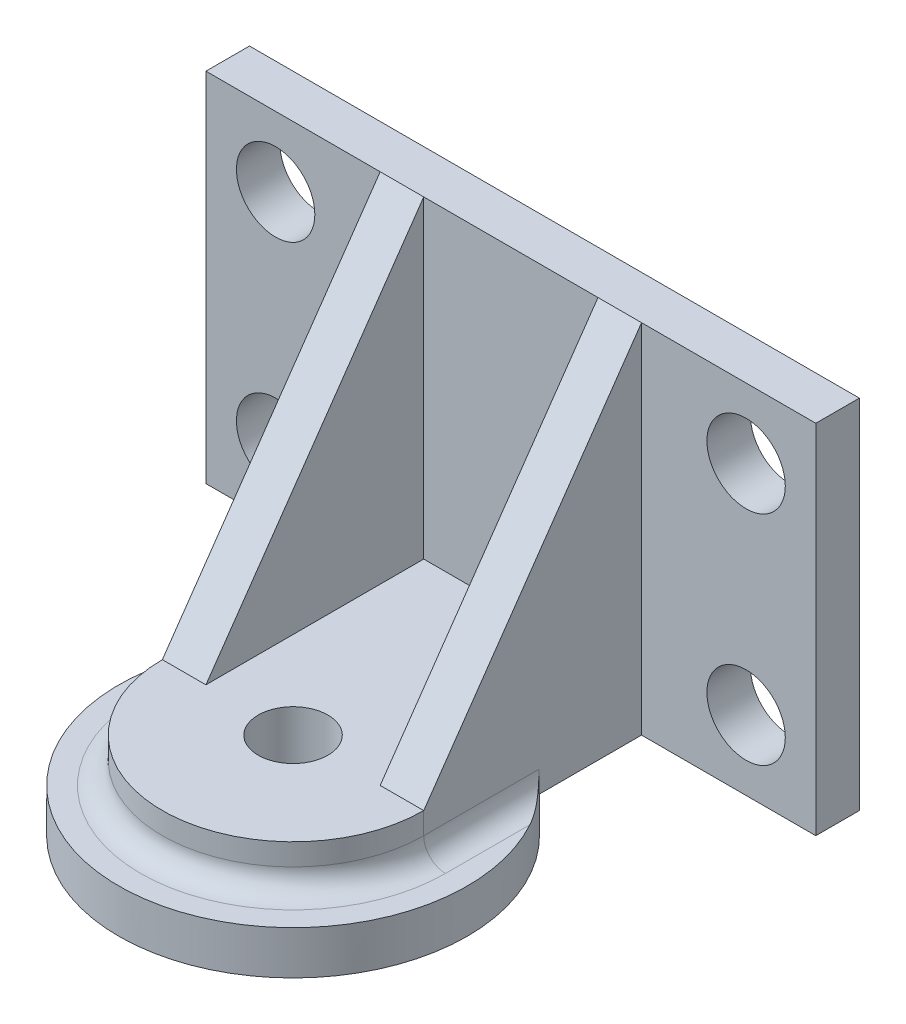
ISO-10303-21;
HEADER;
FILE_DESCRIPTION(('STEP AP214'),'2;1');
FILE_NAME('part.step','',(''),(''),'','','');
FILE_SCHEMA(('AUTOMOTIVE_DESIGN { 1 0 10303 214 1 1 1 1 }'));
ENDSEC;
DATA;
#1=APPLICATION_CONTEXT('core data for automotive mechanical design processes');
#2=APPLICATION_PROTOCOL_DEFINITION('international standard','automotive_design',2000,#1);
#3=PRODUCT_CONTEXT('',#1,'mechanical');
#4=PRODUCT('Part','Part','',(#3));
#5=PRODUCT_RELATED_PRODUCT_CATEGORY('part','',(#4));
#6=PRODUCT_DEFINITION_FORMATION('','',#4);
#7=PRODUCT_DEFINITION_CONTEXT('part definition',#1,'design');
#8=PRODUCT_DEFINITION('design','',#6,#7);
#9=PRODUCT_DEFINITION_SHAPE('','',#8);
#10=(LENGTH_UNIT() NAMED_UNIT(*) SI_UNIT(.MILLI.,.METRE.));
#11=(NAMED_UNIT(*) PLANE_ANGLE_UNIT() SI_UNIT($,.RADIAN.));
#12=(NAMED_UNIT(*) SI_UNIT($,.STERADIAN.) SOLID_ANGLE_UNIT());
#13=UNCERTAINTY_MEASURE_WITH_UNIT(LENGTH_MEASURE(1.E-05),#10,'distance_accuracy_value','');
#14=(GEOMETRIC_REPRESENTATION_CONTEXT(3) GLOBAL_UNCERTAINTY_ASSIGNED_CONTEXT((#13)) GLOBAL_UNIT_ASSIGNED_CONTEXT((#10,
#11,#12)) REPRESENTATION_CONTEXT('',''));
#15=CARTESIAN_POINT('',(0.,0.,0.));
#16=DIRECTION('',(0.,0.,1.));
#17=DIRECTION('',(1.,0.,0.));
#18=AXIS2_PLACEMENT_3D('',#15,#16,#17);
#19=CARTESIAN_POINT('',(0.,0.,5.));
#20=DIRECTION('',(0.,0.,1.));
#21=DIRECTION('',(1.,0.,0.));
#22=AXIS2_PLACEMENT_3D('',#19,#20,#21);
#23=PLANE('',#22);
#24=DIRECTION('',(0.,1.,0.));
#25=VECTOR('',#24,1.);
#26=CARTESIAN_POINT('',(-10.,20.5,5.));
#27=LINE('',#26,#25);
#28=CARTESIAN_POINT('',(-10.,-15.5,5.));
#29=VERTEX_POINT('',#28);
#30=CARTESIAN_POINT('',(-10.,20.5,5.));
#31=VERTEX_POINT('',#30);
#32=EDGE_CURVE('E238',#29,#31,#27,.T.);
#33=ORIENTED_EDGE('',*,*,#32,.F.);
#34=DIRECTION('',(1.,0.,0.));
#35=VECTOR('',#34,1.);
#36=CARTESIAN_POINT('',(-15.,-15.5,5.));
#37=LINE('',#36,#35);
#38=CARTESIAN_POINT('',(10.,-15.5,5.));
#39=VERTEX_POINT('',#38);
#40=EDGE_CURVE('E208',#29,#39,#37,.T.);
#41=ORIENTED_EDGE('',*,*,#40,.T.);
#42=DIRECTION('',(0.,-1.,0.));
#43=VECTOR('',#42,1.);
#44=CARTESIAN_POINT('',(10.,20.5,5.));
#45=LINE('',#44,#43);
#46=CARTESIAN_POINT('',(9.99999999999999,20.5,5.));
#47=VERTEX_POINT('',#46);
#48=EDGE_CURVE('E226',#47,#39,#45,.T.);
#49=ORIENTED_EDGE('',*,*,#48,.F.);
#50=DIRECTION('',(-1.,0.,0.));
#51=VECTOR('',#50,1.);
#52=CARTESIAN_POINT('',(-35.,20.5,5.));
#53=LINE('',#52,#51);
#54=EDGE_CURVE('E296',#47,#31,#53,.T.);
#55=ORIENTED_EDGE('',*,*,#54,.T.);
#56=EDGE_LOOP('',(#33,#41,#49,#55));
#57=FACE_BOUND('',#56,.T.);
#58=ADVANCED_FACE('F39',(#57),#23,.T.);
#59=CARTESIAN_POINT('',(-10.,20.5,30.));
#60=DIRECTION('',(-1.,0.,0.));
#61=DIRECTION('',(0.,-1.,0.));
#62=AXIS2_PLACEMENT_3D('',#59,#60,#61);
#63=PLANE('',#62);
#64=ORIENTED_EDGE('',*,*,#32,.T.);
#65=DIRECTION('',(0.,-0.821369965673296,0.570395809495344));
#66=VECTOR('',#65,1.);
#67=CARTESIAN_POINT('',(-10.,8.78735033836543,13.1337844872462));
#68=LINE('',#67,#66);
#69=CARTESIAN_POINT('',(-9.99999999999999,-15.5,30.));
#70=VERTEX_POINT('',#69);
#71=EDGE_CURVE('E200',#31,#70,#68,.T.);
#72=ORIENTED_EDGE('',*,*,#71,.T.);
#73=DIRECTION('',(0.,0.,1.));
#74=VECTOR('',#73,1.);
#75=CARTESIAN_POINT('',(-10.,-15.5,30.));
#76=LINE('',#75,#74);
#77=EDGE_CURVE('E222',#29,#70,#76,.T.);
#78=ORIENTED_EDGE('',*,*,#77,.F.);
#79=EDGE_LOOP('',(#64,#72,#78));
#80=FACE_BOUND('',#79,.T.);
#81=ADVANCED_FACE('F376',(#80),#63,.F.);
#82=CARTESIAN_POINT('',(10.,20.5,30.));
#83=DIRECTION('',(1.,0.,0.));
#84=DIRECTION('',(0.,0.,-1.));
#85=AXIS2_PLACEMENT_3D('',#82,#83,#84);
#86=PLANE('',#85);
#87=DIRECTION('',(0.,0.,-1.));
#88=VECTOR('',#87,1.);
#89=CARTESIAN_POINT('',(10.,-15.5,30.));
#90=LINE('',#89,#88);
#91=CARTESIAN_POINT('',(10.,-15.5,30.));
#92=VERTEX_POINT('',#91);
#93=EDGE_CURVE('E215',#92,#39,#90,.T.);
#94=ORIENTED_EDGE('',*,*,#93,.F.);
#95=DIRECTION('',(0.,0.821369965673296,-0.570395809495344));
#96=VECTOR('',#95,1.);
#97=CARTESIAN_POINT('',(10.,8.78735033836543,13.1337844872462));
#98=LINE('',#97,#96);
#99=EDGE_CURVE('E196',#92,#47,#98,.T.);
#100=ORIENTED_EDGE('',*,*,#99,.T.);
#101=ORIENTED_EDGE('',*,*,#48,.T.);
#102=EDGE_LOOP('',(#94,#100,#101));
#103=FACE_BOUND('',#102,.T.);
#104=ADVANCED_FACE('F384',(#103),#86,.F.);
#105=CARTESIAN_POINT('',(27.,12.5,5.));
#106=DIRECTION('',(0.,0.,1.));
#107=DIRECTION('',(1.,0.,0.));
#108=AXIS2_PLACEMENT_3D('',#105,#106,#107);
#109=CIRCLE('',#108,4.5);
#110=CARTESIAN_POINT('',(31.5,12.5,5.));
#111=VERTEX_POINT('',#110);
#112=EDGE_CURVE('E254',#111,#111,#109,.T.);
#113=ORIENTED_EDGE('',*,*,#112,.F.);
#114=EDGE_LOOP('',(#113));
#115=FACE_BOUND('',#114,.T.);
#116=CARTESIAN_POINT('',(27.,-12.5,5.));
#117=DIRECTION('',(0.,0.,1.));
#118=DIRECTION('',(1.,0.,0.));
#119=AXIS2_PLACEMENT_3D('',#116,#117,#118);
#120=CIRCLE('',#119,4.5);
#121=CARTESIAN_POINT('',(31.5,-12.5,5.));
#122=VERTEX_POINT('',#121);
#123=EDGE_CURVE('E246',#122,#122,#120,.T.);
#124=ORIENTED_EDGE('',*,*,#123,.F.);
#125=EDGE_LOOP('',(#124));
#126=FACE_BOUND('',#125,.T.);
#127=CARTESIAN_POINT('',(35.,20.5,5.));
#128=VERTEX_POINT('',#127);
#129=CARTESIAN_POINT('',(15.,20.5,5.));
#130=VERTEX_POINT('',#129);
#131=EDGE_CURVE('E291',#128,#130,#53,.T.);
#132=ORIENTED_EDGE('',*,*,#131,.T.);
#133=DIRECTION('',(0.,1.,0.));
#134=VECTOR('',#133,1.);
#135=CARTESIAN_POINT('',(15.,20.5,5.));
#136=LINE('',#135,#134);
#137=CARTESIAN_POINT('',(15.,-20.5,5.));
#138=VERTEX_POINT('',#137);
#139=EDGE_CURVE('E229',#138,#130,#136,.T.);
#140=ORIENTED_EDGE('',*,*,#139,.F.);
#141=DIRECTION('',(1.,0.,0.));
#142=VECTOR('',#141,1.);
#143=CARTESIAN_POINT('',(-35.,-20.5,5.));
#144=LINE('',#143,#142);
#145=CARTESIAN_POINT('',(35.,-20.5,5.));
#146=VERTEX_POINT('',#145);
#147=EDGE_CURVE('E166',#138,#146,#144,.T.);
#148=ORIENTED_EDGE('',*,*,#147,.T.);
#149=DIRECTION('',(0.,1.,0.));
#150=VECTOR('',#149,1.);
#151=CARTESIAN_POINT('',(35.,20.5,5.));
#152=LINE('',#151,#150);
#153=EDGE_CURVE('E287',#146,#128,#152,.T.);
#154=ORIENTED_EDGE('',*,*,#153,.T.);
#155=EDGE_LOOP('',(#132,#140,#148,#154));
#156=FACE_BOUND('',#155,.T.);
#157=ADVANCED_FACE('F379',(#115,#126,#156),#23,.T.);
#158=DIRECTION('',(0.,-1.,0.));
#159=VECTOR('',#158,1.);
#160=CARTESIAN_POINT('',(-15.,20.5,5.));
#161=LINE('',#160,#159);
#162=CARTESIAN_POINT('',(-15.,20.5,5.));
#163=VERTEX_POINT('',#162);
#164=CARTESIAN_POINT('',(-15.,-20.5,5.));
#165=VERTEX_POINT('',#164);
#166=EDGE_CURVE('E168',#163,#165,#161,.T.);
#167=ORIENTED_EDGE('',*,*,#166,.F.);
#168=CARTESIAN_POINT('',(-35.,20.5,5.));
#169=VERTEX_POINT('',#168);
#170=EDGE_CURVE('E290',#163,#169,#53,.T.);
#171=ORIENTED_EDGE('',*,*,#170,.T.);
#172=DIRECTION('',(0.,-1.,0.));
#173=VECTOR('',#172,1.);
#174=CARTESIAN_POINT('',(-35.,20.5,5.));
#175=LINE('',#174,#173);
#176=CARTESIAN_POINT('',(-35.,-20.5,5.));
#177=VERTEX_POINT('',#176);
#178=EDGE_CURVE('E278',#169,#177,#175,.T.);
#179=ORIENTED_EDGE('',*,*,#178,.T.);
#180=EDGE_CURVE('E283',#177,#165,#144,.T.);
#181=ORIENTED_EDGE('',*,*,#180,.T.);
#182=EDGE_LOOP('',(#167,#171,#179,#181));
#183=FACE_BOUND('',#182,.T.);
#184=CARTESIAN_POINT('',(-27.,-12.5,5.));
#185=DIRECTION('',(0.,0.,1.));
#186=DIRECTION('',(1.,0.,0.));
#187=AXIS2_PLACEMENT_3D('',#184,#185,#186);
#188=CIRCLE('',#187,4.5);
#189=CARTESIAN_POINT('',(-22.5,-12.5,5.));
#190=VERTEX_POINT('',#189);
#191=EDGE_CURVE('E262',#190,#190,#188,.T.);
#192=ORIENTED_EDGE('',*,*,#191,.F.);
#193=EDGE_LOOP('',(#192));
#194=FACE_BOUND('',#193,.T.);
#195=CARTESIAN_POINT('',(-27.,12.5,5.));
#196=DIRECTION('',(0.,0.,1.));
#197=DIRECTION('',(1.,0.,0.));
#198=AXIS2_PLACEMENT_3D('',#195,#196,#197);
#199=CIRCLE('',#198,4.5);
#200=CARTESIAN_POINT('',(-22.5,12.5,5.));
#201=VERTEX_POINT('',#200);
#202=EDGE_CURVE('E270',#201,#201,#199,.T.);
#203=ORIENTED_EDGE('',*,*,#202,.F.);
#204=EDGE_LOOP('',(#203));
#205=FACE_BOUND('',#204,.T.);
#206=ADVANCED_FACE('F380',(#183,#194,#205),#23,.T.);
#207=CARTESIAN_POINT('',(0.,0.,0.));
#208=DIRECTION('',(0.,0.,1.));
#209=DIRECTION('',(1.,0.,0.));
#210=AXIS2_PLACEMENT_3D('',#207,#208,#209);
#211=PLANE('',#210);
#212=DIRECTION('',(0.,-1.,0.));
#213=VECTOR('',#212,1.);
#214=CARTESIAN_POINT('',(-35.,20.5,0.));
#215=LINE('',#214,#213);
#216=CARTESIAN_POINT('',(-35.,20.5,0.));
#217=VERTEX_POINT('',#216);
#218=CARTESIAN_POINT('',(-35.,-20.5,0.));
#219=VERTEX_POINT('',#218);
#220=EDGE_CURVE('E274',#217,#219,#215,.T.);
#221=ORIENTED_EDGE('',*,*,#220,.F.);
#222=DIRECTION('',(-1.,0.,0.));
#223=VECTOR('',#222,1.);
#224=CARTESIAN_POINT('',(-35.,20.5,0.));
#225=LINE('',#224,#223);
#226=CARTESIAN_POINT('',(35.,20.5,0.));
#227=VERTEX_POINT('',#226);
#228=EDGE_CURVE('E282',#227,#217,#225,.T.);
#229=ORIENTED_EDGE('',*,*,#228,.F.);
#230=DIRECTION('',(0.,1.,0.));
#231=VECTOR('',#230,1.);
#232=CARTESIAN_POINT('',(35.,20.5,0.));
#233=LINE('',#232,#231);
#234=CARTESIAN_POINT('',(35.,-20.5,0.));
#235=VERTEX_POINT('',#234);
#236=EDGE_CURVE('E303',#235,#227,#233,.T.);
#237=ORIENTED_EDGE('',*,*,#236,.F.);
#238=DIRECTION('',(1.,0.,0.));
#239=VECTOR('',#238,1.);
#240=CARTESIAN_POINT('',(-35.,-20.5,0.));
#241=LINE('',#240,#239);
#242=EDGE_CURVE('E300',#219,#235,#241,.T.);
#243=ORIENTED_EDGE('',*,*,#242,.F.);
#244=EDGE_LOOP('',(#221,#229,#237,#243));
#245=FACE_BOUND('',#244,.T.);
#246=CARTESIAN_POINT('',(-27.,12.5,0.));
#247=DIRECTION('',(0.,0.,1.));
#248=DIRECTION('',(1.,0.,0.));
#249=AXIS2_PLACEMENT_3D('',#246,#247,#248);
#250=CIRCLE('',#249,4.5);
#251=CARTESIAN_POINT('',(-22.5,12.5,0.));
#252=VERTEX_POINT('',#251);
#253=EDGE_CURVE('E266',#252,#252,#250,.T.);
#254=ORIENTED_EDGE('',*,*,#253,.T.);
#255=EDGE_LOOP('',(#254));
#256=FACE_BOUND('',#255,.T.);
#257=CARTESIAN_POINT('',(-27.,-12.5,0.));
#258=DIRECTION('',(0.,0.,1.));
#259=DIRECTION('',(1.,0.,0.));
#260=AXIS2_PLACEMENT_3D('',#257,#258,#259);
#261=CIRCLE('',#260,4.5);
#262=CARTESIAN_POINT('',(-22.5,-12.5,0.));
#263=VERTEX_POINT('',#262);
#264=EDGE_CURVE('E258',#263,#263,#261,.T.);
#265=ORIENTED_EDGE('',*,*,#264,.T.);
#266=EDGE_LOOP('',(#265));
#267=FACE_BOUND('',#266,.T.);
#268=CARTESIAN_POINT('',(27.,12.5,0.));
#269=DIRECTION('',(0.,0.,1.));
#270=DIRECTION('',(1.,0.,0.));
#271=AXIS2_PLACEMENT_3D('',#268,#269,#270);
#272=CIRCLE('',#271,4.5);
#273=CARTESIAN_POINT('',(31.5,12.5,0.));
#274=VERTEX_POINT('',#273);
#275=EDGE_CURVE('E250',#274,#274,#272,.T.);
#276=ORIENTED_EDGE('',*,*,#275,.T.);
#277=EDGE_LOOP('',(#276));
#278=FACE_BOUND('',#277,.T.);
#279=CARTESIAN_POINT('',(27.,-12.5,0.));
#280=DIRECTION('',(0.,0.,1.));
#281=DIRECTION('',(1.,0.,0.));
#282=AXIS2_PLACEMENT_3D('',#279,#280,#281);
#283=CIRCLE('',#282,4.5);
#284=CARTESIAN_POINT('',(31.5,-12.5,0.));
#285=VERTEX_POINT('',#284);
#286=EDGE_CURVE('E245',#285,#285,#283,.T.);
#287=ORIENTED_EDGE('',*,*,#286,.T.);
#288=EDGE_LOOP('',(#287));
#289=FACE_BOUND('',#288,.T.);
#290=ADVANCED_FACE('F393',(#245,#256,#267,#278,#289),#211,.F.);
#291=CARTESIAN_POINT('',(-35.,20.5,5.));
#292=DIRECTION('',(1.,0.,0.));
#293=DIRECTION('',(0.,1.,0.));
#294=AXIS2_PLACEMENT_3D('',#291,#292,#293);
#295=PLANE('',#294);
#296=ORIENTED_EDGE('',*,*,#220,.T.);
#297=DIRECTION('',(0.,0.,-1.));
#298=VECTOR('',#297,1.);
#299=CARTESIAN_POINT('',(-35.,-20.5,5.));
#300=LINE('',#299,#298);
#301=EDGE_CURVE('E319',#177,#219,#300,.T.);
#302=ORIENTED_EDGE('',*,*,#301,.F.);
#303=ORIENTED_EDGE('',*,*,#178,.F.);
#304=DIRECTION('',(0.,0.,-1.));
#305=VECTOR('',#304,1.);
#306=CARTESIAN_POINT('',(-35.,20.5,5.));
#307=LINE('',#306,#305);
#308=EDGE_CURVE('E295',#169,#217,#307,.T.);
#309=ORIENTED_EDGE('',*,*,#308,.T.);
#310=EDGE_LOOP('',(#296,#302,#303,#309));
#311=FACE_BOUND('',#310,.T.);
#312=ADVANCED_FACE('F365',(#311),#295,.F.);
#313=CARTESIAN_POINT('',(-35.,-20.5,5.));
#314=DIRECTION('',(0.,1.,0.));
#315=DIRECTION('',(-1.,0.,0.));
#316=AXIS2_PLACEMENT_3D('',#313,#314,#315);
#317=PLANE('',#316);
#318=CARTESIAN_POINT('',(0.,-20.5,30.));
#319=DIRECTION('',(0.,-1.,0.));
#320=DIRECTION('',(1.,0.,0.));
#321=AXIS2_PLACEMENT_3D('',#318,#319,#320);
#322=CIRCLE('',#321,20.);
#323=CARTESIAN_POINT('',(-15.,-20.5,16.771243444677));
#324=VERTEX_POINT('',#323);
#325=CARTESIAN_POINT('',(15.,-20.5,16.771243444677));
#326=VERTEX_POINT('',#325);
#327=EDGE_CURVE('E164',#324,#326,#322,.T.);
#328=ORIENTED_EDGE('',*,*,#327,.F.);
#329=DIRECTION('',(0.,0.,-1.));
#330=VECTOR('',#329,1.);
#331=CARTESIAN_POINT('',(-15.,-20.5,30.));
#332=LINE('',#331,#330);
#333=EDGE_CURVE('E242',#324,#165,#332,.T.);
#334=ORIENTED_EDGE('',*,*,#333,.T.);
#335=ORIENTED_EDGE('',*,*,#180,.F.);
#336=ORIENTED_EDGE('',*,*,#301,.T.);
#337=ORIENTED_EDGE('',*,*,#242,.T.);
#338=DIRECTION('',(0.,0.,-1.));
#339=VECTOR('',#338,1.);
#340=CARTESIAN_POINT('',(35.,-20.5,5.));
#341=LINE('',#340,#339);
#342=EDGE_CURVE('E315',#146,#235,#341,.T.);
#343=ORIENTED_EDGE('',*,*,#342,.F.);
#344=ORIENTED_EDGE('',*,*,#147,.F.);
#345=DIRECTION('',(0.,0.,-1.));
#346=VECTOR('',#345,1.);
#347=CARTESIAN_POINT('',(15.,-20.5,30.));
#348=LINE('',#347,#346);
#349=EDGE_CURVE('E153',#326,#138,#348,.T.);
#350=ORIENTED_EDGE('',*,*,#349,.F.);
#351=EDGE_LOOP('',(#328,#334,#335,#336,#337,#343,#344,#350));
#352=FACE_BOUND('',#351,.T.);
#353=ADVANCED_FACE('F163',(#352),#317,.F.);
#354=CARTESIAN_POINT('',(35.,20.5,5.));
#355=DIRECTION('',(-1.,0.,0.));
#356=DIRECTION('',(0.,0.,1.));
#357=AXIS2_PLACEMENT_3D('',#354,#355,#356);
#358=PLANE('',#357);
#359=ORIENTED_EDGE('',*,*,#236,.T.);
#360=DIRECTION('',(0.,0.,-1.));
#361=VECTOR('',#360,1.);
#362=CARTESIAN_POINT('',(35.,20.5,5.));
#363=LINE('',#362,#361);
#364=EDGE_CURVE('E311',#128,#227,#363,.T.);
#365=ORIENTED_EDGE('',*,*,#364,.F.);
#366=ORIENTED_EDGE('',*,*,#153,.F.);
#367=ORIENTED_EDGE('',*,*,#342,.T.);
#368=EDGE_LOOP('',(#359,#365,#366,#367));
#369=FACE_BOUND('',#368,.T.);
#370=ADVANCED_FACE('F491',(#369),#358,.F.);
#371=CARTESIAN_POINT('',(-35.,20.5,5.));
#372=DIRECTION('',(0.,-1.,0.));
#373=DIRECTION('',(0.,0.,-1.));
#374=AXIS2_PLACEMENT_3D('',#371,#372,#373);
#375=PLANE('',#374);
#376=ORIENTED_EDGE('',*,*,#170,.F.);
#377=DIRECTION('',(1.,0.,0.));
#378=VECTOR('',#377,1.);
#379=CARTESIAN_POINT('',(-35.,20.5,5.));
#380=LINE('',#379,#378);
#381=EDGE_CURVE('E187',#163,#31,#380,.T.);
#382=ORIENTED_EDGE('',*,*,#381,.T.);
#383=ORIENTED_EDGE('',*,*,#54,.F.);
#384=EDGE_CURVE('E179',#47,#130,#380,.T.);
#385=ORIENTED_EDGE('',*,*,#384,.T.);
#386=ORIENTED_EDGE('',*,*,#131,.F.);
#387=ORIENTED_EDGE('',*,*,#364,.T.);
#388=ORIENTED_EDGE('',*,*,#228,.T.);
#389=ORIENTED_EDGE('',*,*,#308,.F.);
#390=EDGE_LOOP('',(#376,#382,#383,#385,#386,#387,#388,#389));
#391=FACE_BOUND('',#390,.T.);
#392=ADVANCED_FACE('F410',(#391),#375,.F.);
#393=CARTESIAN_POINT('',(-27.,12.5,5.));
#394=DIRECTION('',(0.,0.,-1.));
#395=DIRECTION('',(-1.,0.,0.));
#396=AXIS2_PLACEMENT_3D('',#393,#394,#395);
#397=CYLINDRICAL_SURFACE('',#396,4.5);
#398=ORIENTED_EDGE('',*,*,#202,.T.);
#399=EDGE_LOOP('',(#398));
#400=FACE_BOUND('',#399,.T.);
#401=ORIENTED_EDGE('',*,*,#253,.F.);
#402=EDGE_LOOP('',(#401));
#403=FACE_BOUND('',#402,.T.);
#404=ADVANCED_FACE('F406',(#400,#403),#397,.F.);
#405=CARTESIAN_POINT('',(-27.,-12.5,5.));
#406=DIRECTION('',(0.,0.,-1.));
#407=DIRECTION('',(-1.,0.,0.));
#408=AXIS2_PLACEMENT_3D('',#405,#406,#407);
#409=CYLINDRICAL_SURFACE('',#408,4.5);
#410=ORIENTED_EDGE('',*,*,#191,.T.);
#411=EDGE_LOOP('',(#410));
#412=FACE_BOUND('',#411,.T.);
#413=ORIENTED_EDGE('',*,*,#264,.F.);
#414=EDGE_LOOP('',(#413));
#415=FACE_BOUND('',#414,.T.);
#416=ADVANCED_FACE('F409',(#412,#415),#409,.F.);
#417=CARTESIAN_POINT('',(27.,12.5,5.));
#418=DIRECTION('',(0.,0.,-1.));
#419=DIRECTION('',(-1.,0.,0.));
#420=AXIS2_PLACEMENT_3D('',#417,#418,#419);
#421=CYLINDRICAL_SURFACE('',#420,4.5);
#422=ORIENTED_EDGE('',*,*,#112,.T.);
#423=EDGE_LOOP('',(#422));
#424=FACE_BOUND('',#423,.T.);
#425=ORIENTED_EDGE('',*,*,#275,.F.);
#426=EDGE_LOOP('',(#425));
#427=FACE_BOUND('',#426,.T.);
#428=ADVANCED_FACE('F423',(#424,#427),#421,.F.);
#429=CARTESIAN_POINT('',(27.,-12.5,5.));
#430=DIRECTION('',(0.,0.,-1.));
#431=DIRECTION('',(-1.,0.,0.));
#432=AXIS2_PLACEMENT_3D('',#429,#430,#431);
#433=CYLINDRICAL_SURFACE('',#432,4.5);
#434=ORIENTED_EDGE('',*,*,#123,.T.);
#435=EDGE_LOOP('',(#434));
#436=FACE_BOUND('',#435,.T.);
#437=ORIENTED_EDGE('',*,*,#286,.F.);
#438=EDGE_LOOP('',(#437));
#439=FACE_BOUND('',#438,.T.);
#440=ADVANCED_FACE('F420',(#436,#439),#433,.F.);
#441=CARTESIAN_POINT('',(-15.,20.5,30.));
#442=DIRECTION('',(1.,0.,0.));
#443=DIRECTION('',(0.,1.,0.));
#444=AXIS2_PLACEMENT_3D('',#441,#442,#443);
#445=PLANE('',#444);
#446=ORIENTED_EDGE('',*,*,#333,.F.);
#447=DIRECTION('',(0.,1.,0.));
#448=VECTOR('',#447,1.);
#449=CARTESIAN_POINT('',(-15.,-20.5,16.771243444677));
#450=LINE('',#449,#448);
#451=CARTESIAN_POINT('',(-15.,-18.,16.771243444677));
#452=VERTEX_POINT('',#451);
#453=EDGE_CURVE('E57',#324,#452,#450,.T.);
#454=ORIENTED_EDGE('',*,*,#453,.T.);
#455=DIRECTION('',(0.,0.,-1.));
#456=VECTOR('',#455,1.);
#457=CARTESIAN_POINT('',(-15.,-18.,30.));
#458=LINE('',#457,#456);
#459=CARTESIAN_POINT('',(-15.,-18.,30.));
#460=VERTEX_POINT('',#459);
#461=EDGE_CURVE('E337',#452,#460,#458,.F.);
#462=ORIENTED_EDGE('',*,*,#461,.T.);
#463=DIRECTION('',(0.,-1.,0.));
#464=VECTOR('',#463,1.);
#465=CARTESIAN_POINT('',(-15.,-15.5,30.));
#466=LINE('',#465,#464);
#467=CARTESIAN_POINT('',(-15.,-15.5,30.));
#468=VERTEX_POINT('',#467);
#469=EDGE_CURVE('E211',#468,#460,#466,.T.);
#470=ORIENTED_EDGE('',*,*,#469,.F.);
#471=DIRECTION('',(0.,0.821369965673296,-0.570395809495344));
#472=VECTOR('',#471,1.);
#473=CARTESIAN_POINT('',(-15.,8.78735033836543,13.1337844872462));
#474=LINE('',#473,#472);
#475=EDGE_CURVE('E192',#468,#163,#474,.T.);
#476=ORIENTED_EDGE('',*,*,#475,.T.);
#477=ORIENTED_EDGE('',*,*,#166,.T.);
#478=EDGE_LOOP('',(#446,#454,#462,#470,#476,#477));
#479=FACE_BOUND('',#478,.T.);
#480=ADVANCED_FACE('F422',(#479),#445,.F.);
#481=CARTESIAN_POINT('',(15.,20.5,30.));
#482=DIRECTION('',(-1.,0.,0.));
#483=DIRECTION('',(0.,0.,1.));
#484=AXIS2_PLACEMENT_3D('',#481,#482,#483);
#485=PLANE('',#484);
#486=DIRECTION('',(0.,1.,0.));
#487=VECTOR('',#486,1.);
#488=CARTESIAN_POINT('',(15.,20.5,30.));
#489=LINE('',#488,#487);
#490=CARTESIAN_POINT('',(15.,-18.,30.));
#491=VERTEX_POINT('',#490);
#492=CARTESIAN_POINT('',(15.,-15.5,30.));
#493=VERTEX_POINT('',#492);
#494=EDGE_CURVE('E169',#491,#493,#489,.T.);
#495=ORIENTED_EDGE('',*,*,#494,.F.);
#496=DIRECTION('',(0.,0.,-1.));
#497=VECTOR('',#496,1.);
#498=CARTESIAN_POINT('',(15.,-18.,16.771243444677));
#499=LINE('',#498,#497);
#500=CARTESIAN_POINT('',(15.,-18.,16.771243444677));
#501=VERTEX_POINT('',#500);
#502=EDGE_CURVE('E156',#491,#501,#499,.T.);
#503=ORIENTED_EDGE('',*,*,#502,.T.);
#504=DIRECTION('',(0.,1.,0.));
#505=VECTOR('',#504,1.);
#506=CARTESIAN_POINT('',(15.,-18.,16.771243444677));
#507=LINE('',#506,#505);
#508=EDGE_CURVE('E148',#501,#326,#507,.F.);
#509=ORIENTED_EDGE('',*,*,#508,.T.);
#510=ORIENTED_EDGE('',*,*,#349,.T.);
#511=ORIENTED_EDGE('',*,*,#139,.T.);
#512=DIRECTION('',(0.,-0.821369965673296,0.570395809495344));
#513=VECTOR('',#512,1.);
#514=CARTESIAN_POINT('',(15.,8.78735033836543,13.1337844872462));
#515=LINE('',#514,#513);
#516=EDGE_CURVE('E188',#130,#493,#515,.T.);
#517=ORIENTED_EDGE('',*,*,#516,.T.);
#518=EDGE_LOOP('',(#495,#503,#509,#510,#511,#517));
#519=FACE_BOUND('',#518,.T.);
#520=ADVANCED_FACE('F151',(#519),#485,.F.);
#521=CARTESIAN_POINT('',(0.,-15.5,30.));
#522=DIRECTION('',(0.,-1.,0.));
#523=DIRECTION('',(1.,0.,0.));
#524=AXIS2_PLACEMENT_3D('',#521,#522,#523);
#525=PLANE('',#524);
#526=CARTESIAN_POINT('',(0.,-15.5,30.));
#527=DIRECTION('',(0.,1.,0.));
#528=DIRECTION('',(-1.,0.,0.));
#529=AXIS2_PLACEMENT_3D('',#526,#527,#528);
#530=CIRCLE('',#529,4.);
#531=CARTESIAN_POINT('',(-4.,-15.5,30.));
#532=VERTEX_POINT('',#531);
#533=EDGE_CURVE('E619',#532,#532,#530,.T.);
#534=ORIENTED_EDGE('',*,*,#533,.F.);
#535=EDGE_LOOP('',(#534));
#536=FACE_BOUND('',#535,.T.);
#537=ORIENTED_EDGE('',*,*,#77,.T.);
#538=DIRECTION('',(1.,0.,0.));
#539=VECTOR('',#538,1.);
#540=CARTESIAN_POINT('',(0.,-15.5,30.));
#541=LINE('',#540,#539);
#542=EDGE_CURVE('E219',#468,#70,#541,.T.);
#543=ORIENTED_EDGE('',*,*,#542,.F.);
#544=CARTESIAN_POINT('',(0.,-15.5,30.));
#545=DIRECTION('',(0.,-1.,0.));
#546=DIRECTION('',(1.,0.,0.));
#547=AXIS2_PLACEMENT_3D('',#544,#545,#546);
#548=CIRCLE('',#547,15.);
#549=EDGE_CURVE('E204',#493,#468,#548,.T.);
#550=ORIENTED_EDGE('',*,*,#549,.F.);
#551=DIRECTION('',(1.,0.,0.));
#552=VECTOR('',#551,1.);
#553=CARTESIAN_POINT('',(0.,-15.5,30.));
#554=LINE('',#553,#552);
#555=EDGE_CURVE('E158',#92,#493,#554,.T.);
#556=ORIENTED_EDGE('',*,*,#555,.F.);
#557=ORIENTED_EDGE('',*,*,#93,.T.);
#558=ORIENTED_EDGE('',*,*,#40,.F.);
#559=EDGE_LOOP('',(#537,#543,#550,#556,#557,#558));
#560=FACE_BOUND('',#559,.T.);
#561=ADVANCED_FACE('F532',(#536,#560),#525,.F.);
#562=CARTESIAN_POINT('',(0.,-15.5,30.));
#563=DIRECTION('',(0.,-1.,0.));
#564=DIRECTION('',(1.,0.,0.));
#565=AXIS2_PLACEMENT_3D('',#562,#563,#564);
#566=CYLINDRICAL_SURFACE('',#565,15.);
#567=ORIENTED_EDGE('',*,*,#469,.T.);
#568=CARTESIAN_POINT('',(0.,-18.,30.));
#569=DIRECTION('',(0.,-1.,0.));
#570=DIRECTION('',(1.,0.,0.));
#571=AXIS2_PLACEMENT_3D('',#568,#569,#570);
#572=CIRCLE('',#571,15.);
#573=EDGE_CURVE('E342',#460,#491,#572,.F.);
#574=ORIENTED_EDGE('',*,*,#573,.T.);
#575=ORIENTED_EDGE('',*,*,#494,.T.);
#576=ORIENTED_EDGE('',*,*,#549,.T.);
#577=EDGE_LOOP('',(#567,#574,#575,#576));
#578=FACE_BOUND('',#577,.T.);
#579=ADVANCED_FACE('F506',(#578),#566,.T.);
#580=CARTESIAN_POINT('',(-35.,20.5,5.));
#581=DIRECTION('',(0.,-0.570395809495344,-0.821369965673296));
#582=DIRECTION('',(0.,0.821369965673296,-0.570395809495344));
#583=AXIS2_PLACEMENT_3D('',#580,#581,#582);
#584=PLANE('',#583);
#585=ORIENTED_EDGE('',*,*,#555,.T.);
#586=ORIENTED_EDGE('',*,*,#516,.F.);
#587=ORIENTED_EDGE('',*,*,#384,.F.);
#588=ORIENTED_EDGE('',*,*,#99,.F.);
#589=EDGE_LOOP('',(#585,#586,#587,#588));
#590=FACE_BOUND('',#589,.T.);
#591=ADVANCED_FACE('F500',(#590),#584,.F.);
#592=ORIENTED_EDGE('',*,*,#381,.F.);
#593=ORIENTED_EDGE('',*,*,#475,.F.);
#594=ORIENTED_EDGE('',*,*,#542,.T.);
#595=ORIENTED_EDGE('',*,*,#71,.F.);
#596=EDGE_LOOP('',(#592,#593,#594,#595));
#597=FACE_BOUND('',#596,.T.);
#598=ADVANCED_FACE('F505',(#597),#584,.F.);
#599=CARTESIAN_POINT('',(0.,-25.5,30.));
#600=DIRECTION('',(0.,1.,0.));
#601=DIRECTION('',(-1.,0.,0.));
#602=AXIS2_PLACEMENT_3D('',#599,#600,#601);
#603=CYLINDRICAL_SURFACE('',#602,20.);
#604=CARTESIAN_POINT('',(0.,-25.5,30.));
#605=DIRECTION('',(0.,-1.,0.));
#606=DIRECTION('',(1.,0.,0.));
#607=AXIS2_PLACEMENT_3D('',#604,#605,#606);
#608=CIRCLE('',#607,20.);
#609=CARTESIAN_POINT('',(20.,-25.5,30.));
#610=VERTEX_POINT('',#609);
#611=EDGE_CURVE('E173',#610,#610,#608,.T.);
#612=ORIENTED_EDGE('',*,*,#611,.F.);
#613=EDGE_LOOP('',(#612));
#614=FACE_BOUND('',#613,.T.);
#615=ORIENTED_EDGE('',*,*,#327,.T.);
#616=ORIENTED_EDGE('',*,*,#508,.F.);
#617=CARTESIAN_POINT('',(15.,-18.,16.771243444677));
#618=CARTESIAN_POINT('',(14.9999861208296,-18.0530571161809,16.7712307146122));
#619=CARTESIAN_POINT('',(15.0016885678084,-18.1061040804895,16.7731581635641));
#620=CARTESIAN_POINT('',(15.0084198201057,-18.2116721462362,16.7807949756354));
#621=CARTESIAN_POINT('',(15.0134460235299,-18.264193626412,16.7865013805274));
#622=CARTESIAN_POINT('',(15.0266612844644,-18.3678385086759,16.8015325237782));
#623=CARTESIAN_POINT('',(15.0348225533995,-18.4189700824416,16.8108254750336));
#624=CARTESIAN_POINT('',(15.0541170005206,-18.5199044013112,16.8328523891162));
#625=CARTESIAN_POINT('',(15.065250588999,-18.5697069619163,16.8455868270014));
#626=CARTESIAN_POINT('',(15.1027049877832,-18.7163090724149,16.8885642978361));
#627=CARTESIAN_POINT('',(15.1331331798338,-18.8107043767812,16.9236419066816));
#628=CARTESIAN_POINT('',(15.2028470828024,-18.991216853544,17.0047585741846));
#629=CARTESIAN_POINT('',(15.2421529370798,-19.0773145548067,17.0508225744101));
#630=CARTESIAN_POINT('',(15.3450464186167,-19.2739868695964,17.1727552587932));
#631=CARTESIAN_POINT('',(15.4119686953836,-19.3800457007128,17.2530868905042));
#632=CARTESIAN_POINT('',(15.554093829854,-19.5741629279858,17.4269018190547));
#633=CARTESIAN_POINT('',(15.6293083723406,-19.6621954109852,17.5204037271984));
#634=CARTESIAN_POINT('',(15.7653621790513,-19.8022445012283,17.6929957757947));
#635=CARTESIAN_POINT('',(15.8252321843731,-19.8578082365229,17.7700372604159));
#636=CARTESIAN_POINT('',(15.9464927505803,-19.9603379246989,17.928574000415));
#637=CARTESIAN_POINT('',(16.0078841214287,-20.0072991809784,18.0100716573413));
#638=CARTESIAN_POINT('',(16.1315800678589,-20.0935952343094,18.1770149987545));
#639=CARTESIAN_POINT('',(16.193887606671,-20.1328924839376,18.2624777005535));
#640=CARTESIAN_POINT('',(16.3184996454704,-20.2043627328524,18.4363490419671));
#641=CARTESIAN_POINT('',(16.3808041378418,-20.2365334048927,18.5247586331028));
#642=CARTESIAN_POINT('',(16.5365519756752,-20.3092142672386,18.7496890416102));
#643=CARTESIAN_POINT('',(16.6296781973092,-20.3456156536738,18.8877609309288));
#644=CARTESIAN_POINT('',(16.8136856455586,-20.4058981962403,19.1681871417158));
#645=CARTESIAN_POINT('',(16.9045645348093,-20.4297667996585,19.3105456062976));
#646=CARTESIAN_POINT('',(17.0815861049533,-20.4663655380063,19.5958161198988));
#647=CARTESIAN_POINT('',(17.1677855331068,-20.4792953067986,19.7386682126173));
#648=CARTESIAN_POINT('',(17.3366124339151,-20.4960819597647,20.0265468733556));
#649=CARTESIAN_POINT('',(17.4192479390486,-20.4999604197315,20.1715674393457));
#650=CARTESIAN_POINT('',(17.5,-20.5,20.3175416344814));
#651=B_SPLINE_CURVE_WITH_KNOTS('',3,(#617,#618,#619,#620,#621,#622,#623,#624,#625,#626,#627,
#628,#629,#630,#631,#632,#633,#634,#635,#636,#637,#638,#639,#640,#641,#642,#643,#644,#645,#646,
#647,#648,#649,#650),.UNSPECIFIED.,.F.,.F.,(4,2,2,2,2,2,2,2,2,2,2,2,2,2,2,2,4),(0.,
0.159092542654099,0.318060692094031,0.475651134726811,0.63326334204697,0.947276587145465,
1.26200961447278,1.70631575137297,2.15125616961757,2.48765396922943,2.8242348844371,
3.16242548827867,3.50072636894188,4.01148280429456,4.52274983714691,5.0244715888844,
5.52499614903412),.UNSPECIFIED.);
#652=CARTESIAN_POINT('',(17.5,-20.5,20.3175416344814));
#653=VERTEX_POINT('',#652);
#654=EDGE_CURVE('E50',#501,#653,#651,.T.);
#655=ORIENTED_EDGE('',*,*,#654,.T.);
#656=CARTESIAN_POINT('',(-17.5,-20.5,20.3175416344815));
#657=VERTEX_POINT('',#656);
#658=EDGE_CURVE('E174',#653,#657,#322,.T.);
#659=ORIENTED_EDGE('',*,*,#658,.T.);
#660=CARTESIAN_POINT('',(-17.5,-20.5,20.3175416344815));
#661=CARTESIAN_POINT('',(-17.4491144937282,-20.4999943147626,20.2255687348419));
#662=CARTESIAN_POINT('',(-17.3974970727724,-20.4984459185399,20.1339902528378));
#663=CARTESIAN_POINT('',(-17.2928612486076,-20.4919570749238,19.9517174040726));
#664=CARTESIAN_POINT('',(-17.239842357485,-20.4870154308291,19.8610233606758));
#665=CARTESIAN_POINT('',(-17.1321524295225,-20.4733887423908,19.6800916544265));
#666=CARTESIAN_POINT('',(-17.0774728726259,-20.464679493793,19.5898608258927));
#667=CARTESIAN_POINT('',(-16.9669273633931,-20.443153947936,19.4106436428319));
#668=CARTESIAN_POINT('',(-16.9110615378743,-20.4303380876484,19.3216571569494));
#669=CARTESIAN_POINT('',(-16.7403991703835,-20.3847488301386,19.0544976954471));
#670=CARTESIAN_POINT('',(-16.6239483356402,-20.3449899495405,18.8784933337337));
#671=CARTESIAN_POINT('',(-16.3889343965865,-20.2431867132878,18.5350156815891));
#672=CARTESIAN_POINT('',(-16.2703788868424,-20.1812112472507,18.3675178270274));
#673=CARTESIAN_POINT('',(-16.112040534283,-20.0798688679589,18.1506587492516));
#674=CARTESIAN_POINT('',(-16.0717172113071,-20.0524294114709,18.096033405251));
#675=CARTESIAN_POINT('',(-15.9914097242754,-19.9941464995972,17.9883672689349));
#676=CARTESIAN_POINT('',(-15.9514255829071,-19.9633028184096,17.9353265820264));
#677=CARTESIAN_POINT('',(-15.8324669440144,-19.8654411940853,17.7791143005526));
#678=CARTESIAN_POINT('',(-15.754311379522,-19.7929839154133,17.6786137169522));
#679=CARTESIAN_POINT('',(-15.6020803373121,-19.6310663177179,17.4863968553165));
#680=CARTESIAN_POINT('',(-15.5280508557783,-19.5414504988515,17.3947734476946));
#681=CARTESIAN_POINT('',(-15.3886944984832,-19.3442091576977,17.225020548725));
#682=CARTESIAN_POINT('',(-15.3233570303488,-19.2366059232829,17.1468745982172));
#683=CARTESIAN_POINT('',(-15.2225951772244,-19.0355579660884,17.0278396698068));
#684=CARTESIAN_POINT('',(-15.183882867853,-18.9463348312394,16.9826119910427));
#685=CARTESIAN_POINT('',(-15.1160984539128,-18.7594860012691,16.9039598185218));
#686=CARTESIAN_POINT('',(-15.0870031664792,-18.6618812379103,16.8705069275422));
#687=CARTESIAN_POINT('',(-15.0534676792013,-18.5163464187743,16.8321089886869));
#688=CARTESIAN_POINT('',(-15.0443015111628,-18.470877238979,16.8216413685109));
#689=CARTESIAN_POINT('',(-15.0284472086172,-18.3789432262841,16.8035641405318));
#690=CARTESIAN_POINT('',(-15.0217586422525,-18.3324785683959,16.7959540346474));
#691=CARTESIAN_POINT('',(-15.0109548908845,-18.2385426477702,16.7836728057624));
#692=CARTESIAN_POINT('',(-15.0068574143301,-18.19106670275,16.7790219057458));
#693=CARTESIAN_POINT('',(-15.0013745672131,-18.095729506002,16.7728021014297));
#694=CARTESIAN_POINT('',(-14.9999908447527,-18.0478680378439,16.7712350700065));
#695=CARTESIAN_POINT('',(-15.,-18.,16.771243444677));
#696=B_SPLINE_CURVE_WITH_KNOTS('',3,(#660,#661,#662,#663,#664,#665,#666,#667,#668,#669,#670,
#671,#672,#673,#674,#675,#676,#677,#678,#679,#680,#681,#682,#683,#684,#685,#686,#687,#688,#689,
#690,#691,#692,#693,#694,#695),.UNSPECIFIED.,.F.,.F.,(4,2,2,2,2,2,2,2,2,2,2,2,2,2,2,2,2,4),(0.,
0.315331911174279,0.630775088035716,0.948275585113744,1.26574230917795,1.90892994094774,
2.55014017508313,2.76975251450251,2.98937942955406,3.42769218036523,3.87018321619651,
4.31212997937653,4.63276069556209,4.95261276217368,5.09513449320063,5.2376313703141,
5.38109188683756,5.52463950207491),.UNSPECIFIED.);
#697=EDGE_CURVE('E11',#657,#452,#696,.T.);
#698=ORIENTED_EDGE('',*,*,#697,.T.);
#699=ORIENTED_EDGE('',*,*,#453,.F.);
#700=EDGE_LOOP('',(#615,#616,#655,#659,#698,#699));
#701=FACE_BOUND('',#700,.T.);
#702=ADVANCED_FACE('F171',(#614,#701),#603,.T.);
#703=CARTESIAN_POINT('',(0.,-25.5,30.));
#704=DIRECTION('',(0.,-1.,0.));
#705=DIRECTION('',(1.,0.,0.));
#706=AXIS2_PLACEMENT_3D('',#703,#704,#705);
#707=PLANE('',#706);
#708=CARTESIAN_POINT('',(0.,-25.5,30.));
#709=DIRECTION('',(0.,1.,0.));
#710=DIRECTION('',(-1.,0.,0.));
#711=AXIS2_PLACEMENT_3D('',#708,#709,#710);
#712=CIRCLE('',#711,4.);
#713=CARTESIAN_POINT('',(-4.,-25.5,30.));
#714=VERTEX_POINT('',#713);
#715=EDGE_CURVE('E181',#714,#714,#712,.T.);
#716=ORIENTED_EDGE('',*,*,#715,.T.);
#717=EDGE_LOOP('',(#716));
#718=FACE_BOUND('',#717,.T.);
#719=ORIENTED_EDGE('',*,*,#611,.T.);
#720=EDGE_LOOP('',(#719));
#721=FACE_BOUND('',#720,.T.);
#722=ADVANCED_FACE('F542',(#718,#721),#707,.T.);
#723=CARTESIAN_POINT('',(0.,-20.5,30.));
#724=DIRECTION('',(0.,-1.,0.));
#725=DIRECTION('',(1.,0.,0.));
#726=AXIS2_PLACEMENT_3D('',#723,#724,#725);
#727=PLANE('',#726);
#728=ORIENTED_EDGE('',*,*,#658,.F.);
#729=DIRECTION('',(0.,0.,-1.));
#730=VECTOR('',#729,1.);
#731=CARTESIAN_POINT('',(17.5,-20.5,30.));
#732=LINE('',#731,#730);
#733=CARTESIAN_POINT('',(17.5,-20.5,30.));
#734=VERTEX_POINT('',#733);
#735=EDGE_CURVE('E334',#653,#734,#732,.F.);
#736=ORIENTED_EDGE('',*,*,#735,.T.);
#737=CARTESIAN_POINT('',(0.,-20.5,30.));
#738=DIRECTION('',(0.,-1.,0.));
#739=DIRECTION('',(1.,0.,0.));
#740=AXIS2_PLACEMENT_3D('',#737,#738,#739);
#741=CIRCLE('',#740,17.5);
#742=CARTESIAN_POINT('',(-17.5,-20.5,30.));
#743=VERTEX_POINT('',#742);
#744=EDGE_CURVE('E328',#734,#743,#741,.T.);
#745=ORIENTED_EDGE('',*,*,#744,.T.);
#746=DIRECTION('',(0.,0.,-1.));
#747=VECTOR('',#746,1.);
#748=CARTESIAN_POINT('',(-17.5,-20.5,16.771243444677));
#749=LINE('',#748,#747);
#750=EDGE_CURVE('E331',#743,#657,#749,.T.);
#751=ORIENTED_EDGE('',*,*,#750,.T.);
#752=EDGE_LOOP('',(#728,#736,#745,#751));
#753=FACE_BOUND('',#752,.T.);
#754=ADVANCED_FACE('F547',(#753),#727,.F.);
#755=CARTESIAN_POINT('',(0.,-25.5,30.));
#756=DIRECTION('',(0.,1.,0.));
#757=DIRECTION('',(-1.,0.,0.));
#758=AXIS2_PLACEMENT_3D('',#755,#756,#757);
#759=CYLINDRICAL_SURFACE('',#758,4.);
#760=ORIENTED_EDGE('',*,*,#715,.F.);
#761=EDGE_LOOP('',(#760));
#762=FACE_BOUND('',#761,.T.);
#763=ORIENTED_EDGE('',*,*,#533,.T.);
#764=EDGE_LOOP('',(#763));
#765=FACE_BOUND('',#764,.T.);
#766=ADVANCED_FACE('F372',(#762,#765),#759,.F.);
#767=CARTESIAN_POINT('',(-17.5,-18.,30.));
#768=DIRECTION('',(0.,0.,1.));
#769=DIRECTION('',(1.,0.,0.));
#770=AXIS2_PLACEMENT_3D('',#767,#768,#769);
#771=CYLINDRICAL_SURFACE('',#770,2.5);
#772=ORIENTED_EDGE('',*,*,#697,.F.);
#773=ORIENTED_EDGE('',*,*,#750,.F.);
#774=CARTESIAN_POINT('',(-17.5,-18.,30.));
#775=DIRECTION('',(0.,0.,-1.));
#776=DIRECTION('',(-1.,0.,0.));
#777=AXIS2_PLACEMENT_3D('',#774,#775,#776);
#778=CIRCLE('',#777,2.5);
#779=EDGE_CURVE('E44',#460,#743,#778,.T.);
#780=ORIENTED_EDGE('',*,*,#779,.F.);
#781=ORIENTED_EDGE('',*,*,#461,.F.);
#782=EDGE_LOOP('',(#772,#773,#780,#781));
#783=FACE_BOUND('',#782,.T.);
#784=ADVANCED_FACE('F41',(#783),#771,.F.);
#785=CARTESIAN_POINT('',(0.,-18.,30.));
#786=DIRECTION('',(0.,-1.,0.));
#787=DIRECTION('',(1.,0.,0.));
#788=AXIS2_PLACEMENT_3D('',#785,#786,#787);
#789=TOROIDAL_SURFACE('',#788,17.5,2.5);
#790=ORIENTED_EDGE('',*,*,#779,.T.);
#791=ORIENTED_EDGE('',*,*,#744,.F.);
#792=CARTESIAN_POINT('',(17.5,-18.,30.));
#793=DIRECTION('',(0.,0.,1.));
#794=DIRECTION('',(1.,0.,0.));
#795=AXIS2_PLACEMENT_3D('',#792,#793,#794);
#796=CIRCLE('',#795,2.5);
#797=EDGE_CURVE('E615',#491,#734,#796,.T.);
#798=ORIENTED_EDGE('',*,*,#797,.F.);
#799=ORIENTED_EDGE('',*,*,#573,.F.);
#800=EDGE_LOOP('',(#790,#791,#798,#799));
#801=FACE_BOUND('',#800,.T.);
#802=ADVANCED_FACE('F363',(#801),#789,.F.);
#803=CARTESIAN_POINT('',(17.5,-18.,30.));
#804=DIRECTION('',(0.,0.,1.));
#805=DIRECTION('',(1.,0.,0.));
#806=AXIS2_PLACEMENT_3D('',#803,#804,#805);
#807=CYLINDRICAL_SURFACE('',#806,2.5);
#808=ORIENTED_EDGE('',*,*,#797,.T.);
#809=ORIENTED_EDGE('',*,*,#735,.F.);
#810=ORIENTED_EDGE('',*,*,#654,.F.);
#811=ORIENTED_EDGE('',*,*,#502,.F.);
#812=EDGE_LOOP('',(#808,#809,#810,#811));
#813=FACE_BOUND('',#812,.T.);
#814=ADVANCED_FACE('F359',(#813),#807,.F.);
#815=CLOSED_SHELL('',(#58,#81,#104,#157,#206,#290,#312,#353,#370,#392,#404,#416,#428,#440,#480,
#520,#561,#579,#591,#598,#702,#722,#754,#766,#784,#802,#814));
#816=MANIFOLD_SOLID_BREP('B2',#815);
#817=ADVANCED_BREP_SHAPE_REPRESENTATION('',(#18,#816),#14);
#818=SHAPE_DEFINITION_REPRESENTATION(#9,#817);
ENDSEC;
END-ISO-10303-21;
